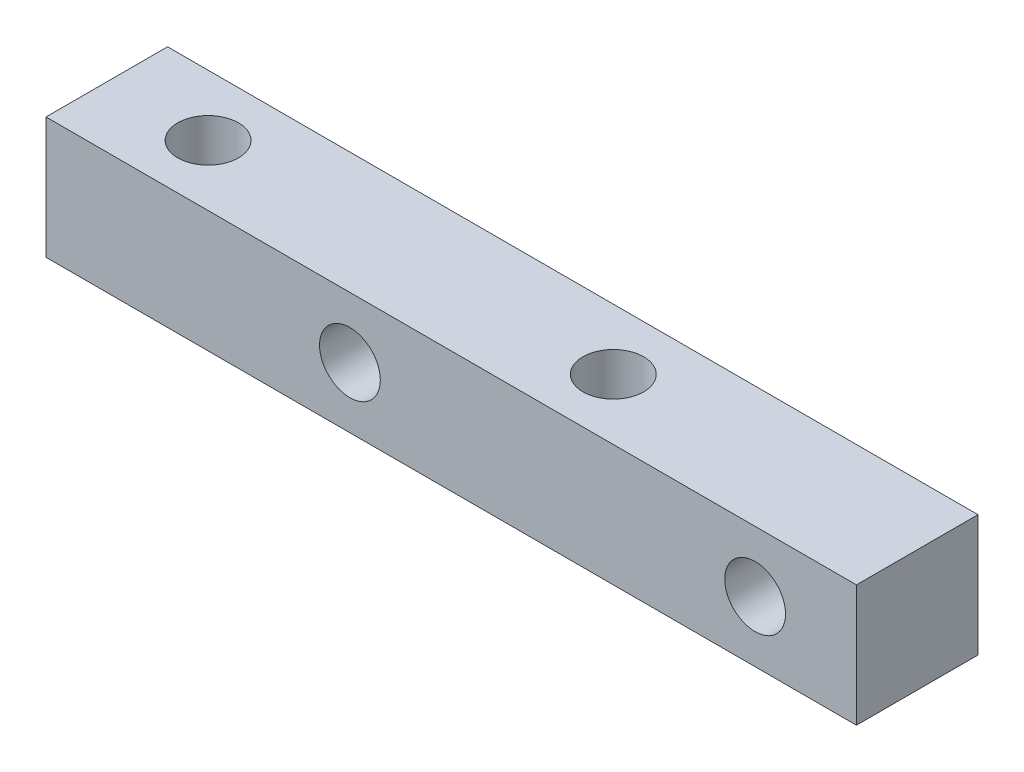
ISO-10303-21;
HEADER;
FILE_DESCRIPTION(('STEP AP214'),'2;1');
FILE_NAME('part.step','',(''),(''),'','','');
FILE_SCHEMA(('AUTOMOTIVE_DESIGN { 1 0 10303 214 1 1 1 1 }'));
ENDSEC;
DATA;
#1=APPLICATION_CONTEXT('core data for automotive mechanical design processes');
#2=APPLICATION_PROTOCOL_DEFINITION('international standard','automotive_design',2000,#1);
#3=PRODUCT_CONTEXT('',#1,'mechanical');
#4=PRODUCT('Part','Part','',(#3));
#5=PRODUCT_RELATED_PRODUCT_CATEGORY('part','',(#4));
#6=PRODUCT_DEFINITION_FORMATION('','',#4);
#7=PRODUCT_DEFINITION_CONTEXT('part definition',#1,'design');
#8=PRODUCT_DEFINITION('design','',#6,#7);
#9=PRODUCT_DEFINITION_SHAPE('','',#8);
#10=(LENGTH_UNIT() NAMED_UNIT(*) SI_UNIT(.MILLI.,.METRE.));
#11=(NAMED_UNIT(*) PLANE_ANGLE_UNIT() SI_UNIT($,.RADIAN.));
#12=(NAMED_UNIT(*) SI_UNIT($,.STERADIAN.) SOLID_ANGLE_UNIT());
#13=UNCERTAINTY_MEASURE_WITH_UNIT(LENGTH_MEASURE(1.E-05),#10,'distance_accuracy_value','');
#14=(GEOMETRIC_REPRESENTATION_CONTEXT(3) GLOBAL_UNCERTAINTY_ASSIGNED_CONTEXT((#13)) GLOBAL_UNIT_ASSIGNED_CONTEXT((#10,
#11,#12)) REPRESENTATION_CONTEXT('',''));
#15=CARTESIAN_POINT('',(0.,0.,0.));
#16=DIRECTION('',(0.,0.,1.));
#17=DIRECTION('',(1.,0.,0.));
#18=AXIS2_PLACEMENT_3D('',#15,#16,#17);
#19=CARTESIAN_POINT('',(20.,3.,6.));
#20=DIRECTION('',(-1.,0.,0.));
#21=DIRECTION('',(0.,0.,1.));
#22=AXIS2_PLACEMENT_3D('',#19,#20,#21);
#23=PLANE('',#22);
#24=DIRECTION('',(0.,1.,0.));
#25=VECTOR('',#24,1.);
#26=CARTESIAN_POINT('',(20.,3.,0.));
#27=LINE('',#26,#25);
#28=CARTESIAN_POINT('',(20.,-3.,0.));
#29=VERTEX_POINT('',#28);
#30=CARTESIAN_POINT('',(20.,3.,0.));
#31=VERTEX_POINT('',#30);
#32=EDGE_CURVE('E102',#29,#31,#27,.T.);
#33=ORIENTED_EDGE('',*,*,#32,.T.);
#34=DIRECTION('',(0.,0.,-1.));
#35=VECTOR('',#34,1.);
#36=CARTESIAN_POINT('',(20.,3.,6.));
#37=LINE('',#36,#35);
#38=CARTESIAN_POINT('',(20.,3.,6.));
#39=VERTEX_POINT('',#38);
#40=EDGE_CURVE('E11',#39,#31,#37,.T.);
#41=ORIENTED_EDGE('',*,*,#40,.F.);
#42=DIRECTION('',(0.,1.,0.));
#43=VECTOR('',#42,1.);
#44=CARTESIAN_POINT('',(20.,3.,6.));
#45=LINE('',#44,#43);
#46=CARTESIAN_POINT('',(20.,-3.,6.));
#47=VERTEX_POINT('',#46);
#48=EDGE_CURVE('E90',#47,#39,#45,.T.);
#49=ORIENTED_EDGE('',*,*,#48,.F.);
#50=DIRECTION('',(0.,0.,-1.));
#51=VECTOR('',#50,1.);
#52=CARTESIAN_POINT('',(20.,-3.,6.));
#53=LINE('',#52,#51);
#54=EDGE_CURVE('E98',#47,#29,#53,.T.);
#55=ORIENTED_EDGE('',*,*,#54,.T.);
#56=EDGE_LOOP('',(#33,#41,#49,#55));
#57=FACE_BOUND('',#56,.T.);
#58=ADVANCED_FACE('F39',(#57),#23,.F.);
#59=CARTESIAN_POINT('',(-20.,3.,6.));
#60=DIRECTION('',(0.,-1.,0.));
#61=DIRECTION('',(0.,0.,-1.));
#62=AXIS2_PLACEMENT_3D('',#59,#60,#61);
#63=PLANE('',#62);
#64=CARTESIAN_POINT('',(-15.,3.,3.));
#65=DIRECTION('',(0.,1.,0.));
#66=DIRECTION('',(0.,0.,1.));
#67=AXIS2_PLACEMENT_3D('',#64,#65,#66);
#68=CIRCLE('',#67,1.5);
#69=CARTESIAN_POINT('',(-15.,3.,4.5));
#70=VERTEX_POINT('',#69);
#71=EDGE_CURVE('E123',#70,#70,#68,.T.);
#72=ORIENTED_EDGE('',*,*,#71,.F.);
#73=EDGE_LOOP('',(#72));
#74=FACE_BOUND('',#73,.T.);
#75=CARTESIAN_POINT('',(5.,3.,3.));
#76=DIRECTION('',(0.,1.,0.));
#77=DIRECTION('',(0.,0.,1.));
#78=AXIS2_PLACEMENT_3D('',#75,#76,#77);
#79=CIRCLE('',#78,1.5);
#80=CARTESIAN_POINT('',(5.,3.,4.5));
#81=VERTEX_POINT('',#80);
#82=EDGE_CURVE('E119',#81,#81,#79,.T.);
#83=ORIENTED_EDGE('',*,*,#82,.F.);
#84=EDGE_LOOP('',(#83));
#85=FACE_BOUND('',#84,.T.);
#86=DIRECTION('',(-1.,0.,0.));
#87=VECTOR('',#86,1.);
#88=CARTESIAN_POINT('',(-20.,3.,0.));
#89=LINE('',#88,#87);
#90=CARTESIAN_POINT('',(-20.,3.,0.));
#91=VERTEX_POINT('',#90);
#92=EDGE_CURVE('E94',#31,#91,#89,.T.);
#93=ORIENTED_EDGE('',*,*,#92,.T.);
#94=DIRECTION('',(0.,0.,-1.));
#95=VECTOR('',#94,1.);
#96=CARTESIAN_POINT('',(-20.,3.,6.));
#97=LINE('',#96,#95);
#98=CARTESIAN_POINT('',(-20.,3.,6.));
#99=VERTEX_POINT('',#98);
#100=EDGE_CURVE('E47',#99,#91,#97,.T.);
#101=ORIENTED_EDGE('',*,*,#100,.F.);
#102=DIRECTION('',(-1.,0.,0.));
#103=VECTOR('',#102,1.);
#104=CARTESIAN_POINT('',(-20.,3.,6.));
#105=LINE('',#104,#103);
#106=EDGE_CURVE('E85',#39,#99,#105,.T.);
#107=ORIENTED_EDGE('',*,*,#106,.F.);
#108=ORIENTED_EDGE('',*,*,#40,.T.);
#109=EDGE_LOOP('',(#93,#101,#107,#108));
#110=FACE_BOUND('',#109,.T.);
#111=ADVANCED_FACE('F93',(#74,#85,#110),#63,.F.);
#112=CARTESIAN_POINT('',(-20.,3.,6.));
#113=DIRECTION('',(1.,0.,0.));
#114=DIRECTION('',(0.,0.,-1.));
#115=AXIS2_PLACEMENT_3D('',#112,#113,#114);
#116=PLANE('',#115);
#117=DIRECTION('',(0.,-1.,0.));
#118=VECTOR('',#117,1.);
#119=CARTESIAN_POINT('',(-20.,3.,0.));
#120=LINE('',#119,#118);
#121=CARTESIAN_POINT('',(-20.,-3.,0.));
#122=VERTEX_POINT('',#121);
#123=EDGE_CURVE('E72',#91,#122,#120,.T.);
#124=ORIENTED_EDGE('',*,*,#123,.T.);
#125=DIRECTION('',(0.,0.,-1.));
#126=VECTOR('',#125,1.);
#127=CARTESIAN_POINT('',(-20.,-3.,6.));
#128=LINE('',#127,#126);
#129=CARTESIAN_POINT('',(-20.,-3.,6.));
#130=VERTEX_POINT('',#129);
#131=EDGE_CURVE('E95',#130,#122,#128,.T.);
#132=ORIENTED_EDGE('',*,*,#131,.F.);
#133=DIRECTION('',(0.,-1.,0.));
#134=VECTOR('',#133,1.);
#135=CARTESIAN_POINT('',(-20.,3.,6.));
#136=LINE('',#135,#134);
#137=EDGE_CURVE('E88',#99,#130,#136,.T.);
#138=ORIENTED_EDGE('',*,*,#137,.F.);
#139=ORIENTED_EDGE('',*,*,#100,.T.);
#140=EDGE_LOOP('',(#124,#132,#138,#139));
#141=FACE_BOUND('',#140,.T.);
#142=ADVANCED_FACE('F96',(#141),#116,.F.);
#143=CARTESIAN_POINT('',(-20.,-3.,6.));
#144=DIRECTION('',(0.,1.,0.));
#145=DIRECTION('',(0.,0.,1.));
#146=AXIS2_PLACEMENT_3D('',#143,#144,#145);
#147=PLANE('',#146);
#148=CARTESIAN_POINT('',(-15.,-3.,3.));
#149=DIRECTION('',(0.,1.,0.));
#150=DIRECTION('',(0.,0.,1.));
#151=AXIS2_PLACEMENT_3D('',#148,#149,#150);
#152=CIRCLE('',#151,1.5);
#153=CARTESIAN_POINT('',(-15.,-3.,4.5));
#154=VERTEX_POINT('',#153);
#155=EDGE_CURVE('E105',#154,#154,#152,.T.);
#156=ORIENTED_EDGE('',*,*,#155,.T.);
#157=EDGE_LOOP('',(#156));
#158=FACE_BOUND('',#157,.T.);
#159=CARTESIAN_POINT('',(5.,-3.,3.));
#160=DIRECTION('',(0.,1.,0.));
#161=DIRECTION('',(0.,0.,1.));
#162=AXIS2_PLACEMENT_3D('',#159,#160,#161);
#163=CIRCLE('',#162,1.5);
#164=CARTESIAN_POINT('',(5.,-3.,4.5));
#165=VERTEX_POINT('',#164);
#166=EDGE_CURVE('E116',#165,#165,#163,.T.);
#167=ORIENTED_EDGE('',*,*,#166,.T.);
#168=EDGE_LOOP('',(#167));
#169=FACE_BOUND('',#168,.T.);
#170=DIRECTION('',(1.,0.,0.));
#171=VECTOR('',#170,1.);
#172=CARTESIAN_POINT('',(-20.,-3.,0.));
#173=LINE('',#172,#171);
#174=EDGE_CURVE('E78',#122,#29,#173,.T.);
#175=ORIENTED_EDGE('',*,*,#174,.T.);
#176=ORIENTED_EDGE('',*,*,#54,.F.);
#177=DIRECTION('',(1.,0.,0.));
#178=VECTOR('',#177,1.);
#179=CARTESIAN_POINT('',(-20.,-3.,6.));
#180=LINE('',#179,#178);
#181=EDGE_CURVE('E55',#130,#47,#180,.T.);
#182=ORIENTED_EDGE('',*,*,#181,.F.);
#183=ORIENTED_EDGE('',*,*,#131,.T.);
#184=EDGE_LOOP('',(#175,#176,#182,#183));
#185=FACE_BOUND('',#184,.T.);
#186=ADVANCED_FACE('F110',(#158,#169,#185),#147,.F.);
#187=CARTESIAN_POINT('',(0.,0.,6.));
#188=DIRECTION('',(0.,0.,1.));
#189=DIRECTION('',(1.,0.,0.));
#190=AXIS2_PLACEMENT_3D('',#187,#188,#189);
#191=PLANE('',#190);
#192=CARTESIAN_POINT('',(-5.,0.,6.));
#193=DIRECTION('',(0.,0.,1.));
#194=DIRECTION('',(1.,0.,0.));
#195=AXIS2_PLACEMENT_3D('',#192,#193,#194);
#196=CIRCLE('',#195,1.5);
#197=CARTESIAN_POINT('',(-3.5,0.,6.));
#198=VERTEX_POINT('',#197);
#199=EDGE_CURVE('E134',#198,#198,#196,.T.);
#200=ORIENTED_EDGE('',*,*,#199,.F.);
#201=EDGE_LOOP('',(#200));
#202=FACE_BOUND('',#201,.T.);
#203=CARTESIAN_POINT('',(15.,0.,6.));
#204=DIRECTION('',(0.,0.,1.));
#205=DIRECTION('',(1.,0.,0.));
#206=AXIS2_PLACEMENT_3D('',#203,#204,#205);
#207=CIRCLE('',#206,1.5);
#208=CARTESIAN_POINT('',(16.5,0.,6.));
#209=VERTEX_POINT('',#208);
#210=EDGE_CURVE('E131',#209,#209,#207,.T.);
#211=ORIENTED_EDGE('',*,*,#210,.F.);
#212=EDGE_LOOP('',(#211));
#213=FACE_BOUND('',#212,.T.);
#214=ORIENTED_EDGE('',*,*,#48,.T.);
#215=ORIENTED_EDGE('',*,*,#106,.T.);
#216=ORIENTED_EDGE('',*,*,#137,.T.);
#217=ORIENTED_EDGE('',*,*,#181,.T.);
#218=EDGE_LOOP('',(#214,#215,#216,#217));
#219=FACE_BOUND('',#218,.T.);
#220=ADVANCED_FACE('F86',(#202,#213,#219),#191,.T.);
#221=CARTESIAN_POINT('',(0.,0.,0.));
#222=DIRECTION('',(0.,0.,1.));
#223=DIRECTION('',(1.,0.,0.));
#224=AXIS2_PLACEMENT_3D('',#221,#222,#223);
#225=PLANE('',#224);
#226=CARTESIAN_POINT('',(-5.,0.,0.));
#227=DIRECTION('',(0.,0.,1.));
#228=DIRECTION('',(1.,0.,0.));
#229=AXIS2_PLACEMENT_3D('',#226,#227,#228);
#230=CIRCLE('',#229,1.5);
#231=CARTESIAN_POINT('',(-3.5,0.,0.));
#232=VERTEX_POINT('',#231);
#233=EDGE_CURVE('E120',#232,#232,#230,.T.);
#234=ORIENTED_EDGE('',*,*,#233,.T.);
#235=EDGE_LOOP('',(#234));
#236=FACE_BOUND('',#235,.T.);
#237=CARTESIAN_POINT('',(15.,0.,0.));
#238=DIRECTION('',(0.,0.,1.));
#239=DIRECTION('',(1.,0.,0.));
#240=AXIS2_PLACEMENT_3D('',#237,#238,#239);
#241=CIRCLE('',#240,1.5);
#242=CARTESIAN_POINT('',(16.5,0.,0.));
#243=VERTEX_POINT('',#242);
#244=EDGE_CURVE('E128',#243,#243,#241,.T.);
#245=ORIENTED_EDGE('',*,*,#244,.T.);
#246=EDGE_LOOP('',(#245));
#247=FACE_BOUND('',#246,.T.);
#248=ORIENTED_EDGE('',*,*,#32,.F.);
#249=ORIENTED_EDGE('',*,*,#174,.F.);
#250=ORIENTED_EDGE('',*,*,#123,.F.);
#251=ORIENTED_EDGE('',*,*,#92,.F.);
#252=EDGE_LOOP('',(#248,#249,#250,#251));
#253=FACE_BOUND('',#252,.T.);
#254=ADVANCED_FACE('F113',(#236,#247,#253),#225,.F.);
#255=CARTESIAN_POINT('',(5.,-3.,3.));
#256=DIRECTION('',(0.,1.,0.));
#257=DIRECTION('',(0.,0.,1.));
#258=AXIS2_PLACEMENT_3D('',#255,#256,#257);
#259=CYLINDRICAL_SURFACE('',#258,1.5);
#260=ORIENTED_EDGE('',*,*,#166,.F.);
#261=EDGE_LOOP('',(#260));
#262=FACE_BOUND('',#261,.T.);
#263=ORIENTED_EDGE('',*,*,#82,.T.);
#264=EDGE_LOOP('',(#263));
#265=FACE_BOUND('',#264,.T.);
#266=ADVANCED_FACE('F161',(#262,#265),#259,.F.);
#267=CARTESIAN_POINT('',(-15.,-3.,3.));
#268=DIRECTION('',(0.,1.,0.));
#269=DIRECTION('',(0.,0.,1.));
#270=AXIS2_PLACEMENT_3D('',#267,#268,#269);
#271=CYLINDRICAL_SURFACE('',#270,1.5);
#272=ORIENTED_EDGE('',*,*,#155,.F.);
#273=EDGE_LOOP('',(#272));
#274=FACE_BOUND('',#273,.T.);
#275=ORIENTED_EDGE('',*,*,#71,.T.);
#276=EDGE_LOOP('',(#275));
#277=FACE_BOUND('',#276,.T.);
#278=ADVANCED_FACE('F155',(#274,#277),#271,.F.);
#279=CARTESIAN_POINT('',(15.,0.,0.));
#280=DIRECTION('',(0.,0.,1.));
#281=DIRECTION('',(1.,0.,0.));
#282=AXIS2_PLACEMENT_3D('',#279,#280,#281);
#283=CYLINDRICAL_SURFACE('',#282,1.5);
#284=ORIENTED_EDGE('',*,*,#244,.F.);
#285=EDGE_LOOP('',(#284));
#286=FACE_BOUND('',#285,.T.);
#287=ORIENTED_EDGE('',*,*,#210,.T.);
#288=EDGE_LOOP('',(#287));
#289=FACE_BOUND('',#288,.T.);
#290=ADVANCED_FACE('F145',(#286,#289),#283,.F.);
#291=CARTESIAN_POINT('',(-5.,0.,0.));
#292=DIRECTION('',(0.,0.,1.));
#293=DIRECTION('',(1.,0.,0.));
#294=AXIS2_PLACEMENT_3D('',#291,#292,#293);
#295=CYLINDRICAL_SURFACE('',#294,1.5);
#296=ORIENTED_EDGE('',*,*,#233,.F.);
#297=EDGE_LOOP('',(#296));
#298=FACE_BOUND('',#297,.T.);
#299=ORIENTED_EDGE('',*,*,#199,.T.);
#300=EDGE_LOOP('',(#299));
#301=FACE_BOUND('',#300,.T.);
#302=ADVANCED_FACE('F142',(#298,#301),#295,.F.);
#303=CLOSED_SHELL('',(#58,#111,#142,#186,#220,#254,#266,#278,#290,#302));
#304=MANIFOLD_SOLID_BREP('B2',#303);
#305=ADVANCED_BREP_SHAPE_REPRESENTATION('',(#18,#304),#14);
#306=SHAPE_DEFINITION_REPRESENTATION(#9,#305);
ENDSEC;
END-ISO-10303-21;
